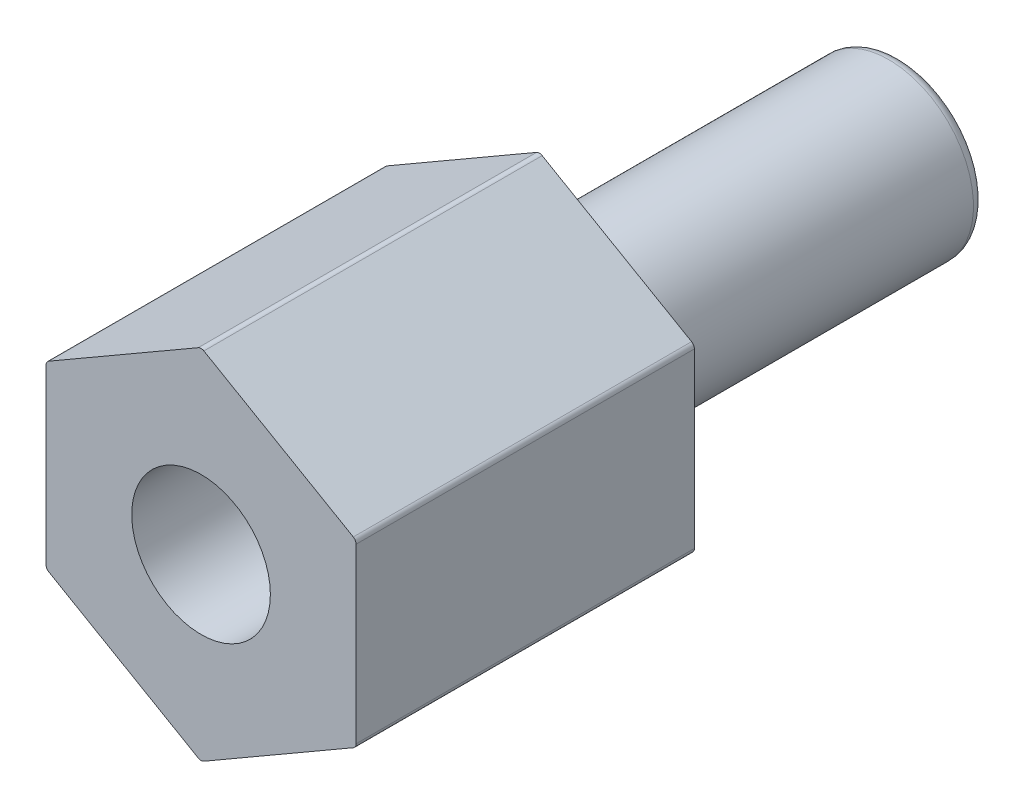
ISO-10303-21;
HEADER;
FILE_DESCRIPTION(('STEP AP214'),'2;1');
FILE_NAME('part.step','',(''),(''),'','','');
FILE_SCHEMA(('AUTOMOTIVE_DESIGN { 1 0 10303 214 1 1 1 1 }'));
ENDSEC;
DATA;
#1=APPLICATION_CONTEXT('core data for automotive mechanical design processes');
#2=APPLICATION_PROTOCOL_DEFINITION('international standard','automotive_design',2000,#1);
#3=PRODUCT_CONTEXT('',#1,'mechanical');
#4=PRODUCT('Part','Part','',(#3));
#5=PRODUCT_RELATED_PRODUCT_CATEGORY('part','',(#4));
#6=PRODUCT_DEFINITION_FORMATION('','',#4);
#7=PRODUCT_DEFINITION_CONTEXT('part definition',#1,'design');
#8=PRODUCT_DEFINITION('design','',#6,#7);
#9=PRODUCT_DEFINITION_SHAPE('','',#8);
#10=(LENGTH_UNIT() NAMED_UNIT(*) SI_UNIT(.MILLI.,.METRE.));
#11=(NAMED_UNIT(*) PLANE_ANGLE_UNIT() SI_UNIT($,.RADIAN.));
#12=(NAMED_UNIT(*) SI_UNIT($,.STERADIAN.) SOLID_ANGLE_UNIT());
#13=UNCERTAINTY_MEASURE_WITH_UNIT(LENGTH_MEASURE(1.E-05),#10,'distance_accuracy_value','');
#14=(GEOMETRIC_REPRESENTATION_CONTEXT(3) GLOBAL_UNCERTAINTY_ASSIGNED_CONTEXT((#13)) GLOBAL_UNIT_ASSIGNED_CONTEXT((#10,
#11,#12)) REPRESENTATION_CONTEXT('',''));
#15=CARTESIAN_POINT('',(0.,0.,0.));
#16=DIRECTION('',(0.,0.,1.));
#17=DIRECTION('',(1.,0.,0.));
#18=AXIS2_PLACEMENT_3D('',#15,#16,#17);
#19=CARTESIAN_POINT('',(0.,0.,-6.2));
#20=DIRECTION('',(0.,0.,-1.));
#21=DIRECTION('',(-1.,0.,0.));
#22=AXIS2_PLACEMENT_3D('',#19,#20,#21);
#23=TOROIDAL_SURFACE('',#22,1.3,0.2);
#24=CARTESIAN_POINT('',(0.,0.,-6.2));
#25=DIRECTION('',(0.,0.,-1.));
#26=DIRECTION('',(1.,0.,0.));
#27=AXIS2_PLACEMENT_3D('',#24,#25,#26);
#28=CIRCLE('',#27,1.5);
#29=CARTESIAN_POINT('',(-1.5,0.,-6.2));
#30=VERTEX_POINT('',#29);
#31=EDGE_CURVE('E11',#30,#30,#28,.T.);
#32=ORIENTED_EDGE('',*,*,#31,.T.);
#33=EDGE_LOOP('',(#32));
#34=FACE_BOUND('',#33,.T.);
#35=CARTESIAN_POINT('',(0.,0.,-6.4));
#36=DIRECTION('',(0.,0.,1.));
#37=DIRECTION('',(1.,0.,0.));
#38=AXIS2_PLACEMENT_3D('',#35,#36,#37);
#39=CIRCLE('',#38,1.3);
#40=CARTESIAN_POINT('',(-1.3,0.,-6.4));
#41=VERTEX_POINT('',#40);
#42=EDGE_CURVE('E30',#41,#41,#39,.T.);
#43=ORIENTED_EDGE('',*,*,#42,.T.);
#44=EDGE_LOOP('',(#43));
#45=FACE_BOUND('',#44,.T.);
#46=ADVANCED_FACE('F19',(#34,#45),#23,.T.);
#47=CARTESIAN_POINT('',(0.,0.,0.));
#48=DIRECTION('',(0.,0.,-1.));
#49=DIRECTION('',(1.,0.,0.));
#50=AXIS2_PLACEMENT_3D('',#47,#48,#49);
#51=CYLINDRICAL_SURFACE('',#50,1.5);
#52=CARTESIAN_POINT('',(0.,0.,0.));
#53=DIRECTION('',(0.,0.,1.));
#54=DIRECTION('',(1.,0.,0.));
#55=AXIS2_PLACEMENT_3D('',#52,#53,#54);
#56=CIRCLE('',#55,1.5);
#57=CARTESIAN_POINT('',(-1.5,0.,0.));
#58=VERTEX_POINT('',#57);
#59=EDGE_CURVE('E212',#58,#58,#56,.T.);
#60=ORIENTED_EDGE('',*,*,#59,.F.);
#61=EDGE_LOOP('',(#60));
#62=FACE_BOUND('',#61,.T.);
#63=ORIENTED_EDGE('',*,*,#31,.F.);
#64=EDGE_LOOP('',(#63));
#65=FACE_BOUND('',#64,.T.);
#66=ADVANCED_FACE('F323',(#62,#65),#51,.T.);
#67=CARTESIAN_POINT('',(0.,0.,-6.4));
#68=DIRECTION('',(0.,0.,1.));
#69=DIRECTION('',(1.,0.,0.));
#70=AXIS2_PLACEMENT_3D('',#67,#68,#69);
#71=PLANE('',#70);
#72=ORIENTED_EDGE('',*,*,#42,.F.);
#73=EDGE_LOOP('',(#72));
#74=FACE_BOUND('',#73,.T.);
#75=ADVANCED_FACE('F342',(#74),#71,.F.);
#76=CARTESIAN_POINT('',(0.,0.,0.));
#77=DIRECTION('',(0.,0.,1.));
#78=DIRECTION('',(1.,0.,0.));
#79=AXIS2_PLACEMENT_3D('',#76,#77,#78);
#80=PLANE('',#79);
#81=CARTESIAN_POINT('',(0.,0.,0.));
#82=DIRECTION('',(0.,0.,1.));
#83=DIRECTION('',(1.,0.,0.));
#84=AXIS2_PLACEMENT_3D('',#81,#82,#83);
#85=CIRCLE('',#84,1.2295);
#86=CARTESIAN_POINT('',(-1.2295,0.,0.));
#87=VERTEX_POINT('',#86);
#88=EDGE_CURVE('E186',#87,#87,#85,.T.);
#89=ORIENTED_EDGE('',*,*,#88,.T.);
#90=EDGE_LOOP('',(#89));
#91=FACE_BOUND('',#90,.T.);
#92=ADVANCED_FACE('F370',(#91),#80,.T.);
#93=CARTESIAN_POINT('',(-2.65,-1.53230652808246,0.));
#94=DIRECTION('',(0.,0.,1.));
#95=DIRECTION('',(-0.866181221002111,-0.499730019493819,0.));
#96=AXIS2_PLACEMENT_3D('',#93,#94,#95);
#97=CYLINDRICAL_SURFACE('',#96,0.1);
#98=CARTESIAN_POINT('',(-2.65,-1.53230652808246,6.));
#99=DIRECTION('',(0.,0.,-1.));
#100=DIRECTION('',(-0.866181221002111,-0.499730019493819,0.));
#101=AXIS2_PLACEMENT_3D('',#98,#99,#100);
#102=CIRCLE('',#101,0.1);
#103=CARTESIAN_POINT('',(-2.70005398152334,-1.61887787977378,6.));
#104=VERTEX_POINT('',#103);
#105=CARTESIAN_POINT('',(-2.75,-1.53230652808246,6.));
#106=VERTEX_POINT('',#105);
#107=EDGE_CURVE('E216',#104,#106,#102,.T.);
#108=ORIENTED_EDGE('',*,*,#107,.T.);
#109=DIRECTION('',(0.,0.,-1.));
#110=VECTOR('',#109,1.);
#111=CARTESIAN_POINT('',(-2.75,-1.53230652808246,0.));
#112=LINE('',#111,#110);
#113=CARTESIAN_POINT('',(-2.75,-1.53230652808246,0.));
#114=VERTEX_POINT('',#113);
#115=EDGE_CURVE('E206',#106,#114,#112,.T.);
#116=ORIENTED_EDGE('',*,*,#115,.T.);
#117=CARTESIAN_POINT('',(-2.65,-1.53230652808246,0.));
#118=DIRECTION('',(0.,0.,1.));
#119=DIRECTION('',(-0.866181221002111,-0.499730019493819,0.));
#120=AXIS2_PLACEMENT_3D('',#117,#118,#119);
#121=CIRCLE('',#120,0.1);
#122=CARTESIAN_POINT('',(-2.70005398152334,-1.61887787977378,0.));
#123=VERTEX_POINT('',#122);
#124=EDGE_CURVE('E202',#114,#123,#121,.T.);
#125=ORIENTED_EDGE('',*,*,#124,.T.);
#126=DIRECTION('',(0.,0.,1.));
#127=VECTOR('',#126,1.);
#128=CARTESIAN_POINT('',(-2.70005398152334,-1.61887787977378,0.));
#129=LINE('',#128,#127);
#130=EDGE_CURVE('E207',#123,#104,#129,.T.);
#131=ORIENTED_EDGE('',*,*,#130,.T.);
#132=EDGE_LOOP('',(#108,#116,#125,#131));
#133=FACE_BOUND('',#132,.T.);
#134=ADVANCED_FACE('F367',(#133),#97,.T.);
#135=CARTESIAN_POINT('',(-2.75,1.59,0.));
#136=DIRECTION('',(-1.,0.,0.));
#137=DIRECTION('',(0.,0.,1.));
#138=AXIS2_PLACEMENT_3D('',#135,#136,#137);
#139=PLANE('',#138);
#140=ORIENTED_EDGE('',*,*,#115,.F.);
#141=DIRECTION('',(0.,-1.,0.));
#142=VECTOR('',#141,1.);
#143=CARTESIAN_POINT('',(-2.75,-1.59,6.));
#144=LINE('',#143,#142);
#145=CARTESIAN_POINT('',(-2.75,1.53230652808246,6.));
#146=VERTEX_POINT('',#145);
#147=EDGE_CURVE('E149',#146,#106,#144,.T.);
#148=ORIENTED_EDGE('',*,*,#147,.F.);
#149=DIRECTION('',(0.,0.,1.));
#150=VECTOR('',#149,1.);
#151=CARTESIAN_POINT('',(-2.75,1.53230652808246,0.));
#152=LINE('',#151,#150);
#153=CARTESIAN_POINT('',(-2.75,1.53230652808246,0.));
#154=VERTEX_POINT('',#153);
#155=EDGE_CURVE('E201',#154,#146,#152,.T.);
#156=ORIENTED_EDGE('',*,*,#155,.F.);
#157=DIRECTION('',(0.,1.,0.));
#158=VECTOR('',#157,1.);
#159=CARTESIAN_POINT('',(-2.75,-1.59,0.));
#160=LINE('',#159,#158);
#161=EDGE_CURVE('E196',#114,#154,#160,.T.);
#162=ORIENTED_EDGE('',*,*,#161,.F.);
#163=EDGE_LOOP('',(#140,#148,#156,#162));
#164=FACE_BOUND('',#163,.T.);
#165=ADVANCED_FACE('F354',(#164),#139,.T.);
#166=CARTESIAN_POINT('',(0.,0.,6.));
#167=DIRECTION('',(0.,0.,1.));
#168=DIRECTION('',(1.,0.,0.));
#169=AXIS2_PLACEMENT_3D('',#166,#167,#168);
#170=PLANE('',#169);
#171=ORIENTED_EDGE('',*,*,#107,.F.);
#172=DIRECTION('',(0.865713516913132,-0.50053981523341,0.));
#173=VECTOR('',#172,1.);
#174=CARTESIAN_POINT('',(0.,-3.18,6.));
#175=LINE('',#174,#173);
#176=CARTESIAN_POINT('',(-0.050053981523341,-3.1510596979556,6.));
#177=VERTEX_POINT('',#176);
#178=EDGE_CURVE('E235',#104,#177,#175,.T.);
#179=ORIENTED_EDGE('',*,*,#178,.T.);
#180=CARTESIAN_POINT('',(0.,-3.06448834626428,6.));
#181=DIRECTION('',(0.,0.,-1.));
#182=DIRECTION('',(0.,-1.,0.));
#183=AXIS2_PLACEMENT_3D('',#180,#181,#182);
#184=CIRCLE('',#183,0.1);
#185=CARTESIAN_POINT('',(0.0500539815233414,-3.15105969795559,6.));
#186=VERTEX_POINT('',#185);
#187=EDGE_CURVE('E150',#186,#177,#184,.T.);
#188=ORIENTED_EDGE('',*,*,#187,.F.);
#189=DIRECTION('',(0.865713516913132,0.50053981523341,0.));
#190=VECTOR('',#189,1.);
#191=CARTESIAN_POINT('',(2.75,-1.59,6.));
#192=LINE('',#191,#190);
#193=CARTESIAN_POINT('',(2.70005398152334,-1.61887787977378,6.));
#194=VERTEX_POINT('',#193);
#195=EDGE_CURVE('E252',#186,#194,#192,.T.);
#196=ORIENTED_EDGE('',*,*,#195,.T.);
#197=CARTESIAN_POINT('',(2.65,-1.53230652808246,6.));
#198=DIRECTION('',(0.,0.,-1.));
#199=DIRECTION('',(0.866181221002107,-0.499730019493825,0.));
#200=AXIS2_PLACEMENT_3D('',#197,#198,#199);
#201=CIRCLE('',#200,0.1);
#202=CARTESIAN_POINT('',(2.75,-1.53230652808246,6.));
#203=VERTEX_POINT('',#202);
#204=EDGE_CURVE('E163',#203,#194,#201,.T.);
#205=ORIENTED_EDGE('',*,*,#204,.F.);
#206=DIRECTION('',(0.,1.,0.));
#207=VECTOR('',#206,1.);
#208=CARTESIAN_POINT('',(2.75,1.59,6.));
#209=LINE('',#208,#207);
#210=CARTESIAN_POINT('',(2.75,1.53230652808246,6.));
#211=VERTEX_POINT('',#210);
#212=EDGE_CURVE('E248',#203,#211,#209,.T.);
#213=ORIENTED_EDGE('',*,*,#212,.T.);
#214=CARTESIAN_POINT('',(2.65,1.53230652808246,6.));
#215=DIRECTION('',(0.,0.,-1.));
#216=DIRECTION('',(0.866181221002109,0.499730019493822,0.));
#217=AXIS2_PLACEMENT_3D('',#214,#215,#216);
#218=CIRCLE('',#217,0.1);
#219=CARTESIAN_POINT('',(2.70005398152334,1.61887787977378,6.));
#220=VERTEX_POINT('',#219);
#221=EDGE_CURVE('E213',#220,#211,#218,.T.);
#222=ORIENTED_EDGE('',*,*,#221,.F.);
#223=DIRECTION('',(-0.865713516913132,0.500539815233411,0.));
#224=VECTOR('',#223,1.);
#225=CARTESIAN_POINT('',(0.,3.18,6.));
#226=LINE('',#225,#224);
#227=CARTESIAN_POINT('',(0.0500539815233408,3.15105969795559,6.));
#228=VERTEX_POINT('',#227);
#229=EDGE_CURVE('E253',#220,#228,#226,.T.);
#230=ORIENTED_EDGE('',*,*,#229,.T.);
#231=CARTESIAN_POINT('',(0.,3.06448834626428,6.));
#232=DIRECTION('',(0.,0.,-1.));
#233=DIRECTION('',(0.,1.,0.));
#234=AXIS2_PLACEMENT_3D('',#231,#232,#233);
#235=CIRCLE('',#234,0.1);
#236=CARTESIAN_POINT('',(-0.050053981523342,3.15105969795559,6.));
#237=VERTEX_POINT('',#236);
#238=EDGE_CURVE('E166',#237,#228,#235,.T.);
#239=ORIENTED_EDGE('',*,*,#238,.F.);
#240=DIRECTION('',(-0.865713516913132,-0.500539815233411,0.));
#241=VECTOR('',#240,1.);
#242=CARTESIAN_POINT('',(-2.75,1.59,6.));
#243=LINE('',#242,#241);
#244=CARTESIAN_POINT('',(-2.70005398152334,1.61887787977378,6.));
#245=VERTEX_POINT('',#244);
#246=EDGE_CURVE('E158',#237,#245,#243,.T.);
#247=ORIENTED_EDGE('',*,*,#246,.T.);
#248=CARTESIAN_POINT('',(-2.65,1.53230652808246,6.));
#249=DIRECTION('',(0.,0.,-1.));
#250=DIRECTION('',(-0.866181221002109,0.499730019493822,0.));
#251=AXIS2_PLACEMENT_3D('',#248,#249,#250);
#252=CIRCLE('',#251,0.1);
#253=EDGE_CURVE('E191',#146,#245,#252,.T.);
#254=ORIENTED_EDGE('',*,*,#253,.F.);
#255=ORIENTED_EDGE('',*,*,#147,.T.);
#256=EDGE_LOOP('',(#171,#179,#188,#196,#205,#213,#222,#230,#239,#247,#254,#255));
#257=FACE_BOUND('',#256,.T.);
#258=CARTESIAN_POINT('',(0.,0.,6.));
#259=DIRECTION('',(0.,0.,-1.));
#260=DIRECTION('',(1.,0.,0.));
#261=AXIS2_PLACEMENT_3D('',#258,#259,#260);
#262=CIRCLE('',#261,1.2295);
#263=CARTESIAN_POINT('',(1.2295,0.,6.));
#264=VERTEX_POINT('',#263);
#265=EDGE_CURVE('E145',#264,#264,#262,.T.);
#266=ORIENTED_EDGE('',*,*,#265,.T.);
#267=EDGE_LOOP('',(#266));
#268=FACE_BOUND('',#267,.T.);
#269=ADVANCED_FACE('F304',(#257,#268),#170,.T.);
#270=CARTESIAN_POINT('',(0.,-3.06448834626428,0.));
#271=DIRECTION('',(0.,0.,1.));
#272=DIRECTION('',(0.,-1.,0.));
#273=AXIS2_PLACEMENT_3D('',#270,#271,#272);
#274=CYLINDRICAL_SURFACE('',#273,0.1);
#275=ORIENTED_EDGE('',*,*,#187,.T.);
#276=DIRECTION('',(0.,0.,-1.));
#277=VECTOR('',#276,1.);
#278=CARTESIAN_POINT('',(-0.0500539815233408,-3.15105969795559,0.));
#279=LINE('',#278,#277);
#280=CARTESIAN_POINT('',(-0.050053981523341,-3.1510596979556,0.));
#281=VERTEX_POINT('',#280);
#282=EDGE_CURVE('E160',#177,#281,#279,.T.);
#283=ORIENTED_EDGE('',*,*,#282,.T.);
#284=CARTESIAN_POINT('',(0.,-3.06448834626428,0.));
#285=DIRECTION('',(0.,0.,1.));
#286=DIRECTION('',(0.,-1.,0.));
#287=AXIS2_PLACEMENT_3D('',#284,#285,#286);
#288=CIRCLE('',#287,0.1);
#289=CARTESIAN_POINT('',(0.0500539815233414,-3.15105969795559,0.));
#290=VERTEX_POINT('',#289);
#291=EDGE_CURVE('E227',#281,#290,#288,.T.);
#292=ORIENTED_EDGE('',*,*,#291,.T.);
#293=DIRECTION('',(0.,0.,1.));
#294=VECTOR('',#293,1.);
#295=CARTESIAN_POINT('',(0.0500539815233412,-3.15105969795559,0.));
#296=LINE('',#295,#294);
#297=EDGE_CURVE('E231',#290,#186,#296,.T.);
#298=ORIENTED_EDGE('',*,*,#297,.T.);
#299=EDGE_LOOP('',(#275,#283,#292,#298));
#300=FACE_BOUND('',#299,.T.);
#301=ADVANCED_FACE('F353',(#300),#274,.T.);
#302=CARTESIAN_POINT('',(0.,-3.18,0.));
#303=DIRECTION('',(0.50053981523341,-0.865713516913132,0.));
#304=DIRECTION('',(0.,0.,-1.));
#305=AXIS2_PLACEMENT_3D('',#302,#303,#304);
#306=PLANE('',#305);
#307=ORIENTED_EDGE('',*,*,#297,.F.);
#308=DIRECTION('',(-0.865713516913132,-0.50053981523341,0.));
#309=VECTOR('',#308,1.);
#310=CARTESIAN_POINT('',(2.75,-1.59,0.));
#311=LINE('',#310,#309);
#312=CARTESIAN_POINT('',(2.70005398152334,-1.61887787977378,0.));
#313=VERTEX_POINT('',#312);
#314=EDGE_CURVE('E23',#313,#290,#311,.T.);
#315=ORIENTED_EDGE('',*,*,#314,.F.);
#316=DIRECTION('',(0.,0.,-1.));
#317=VECTOR('',#316,1.);
#318=CARTESIAN_POINT('',(2.70005398152334,-1.61887787977378,0.));
#319=LINE('',#318,#317);
#320=EDGE_CURVE('E254',#194,#313,#319,.T.);
#321=ORIENTED_EDGE('',*,*,#320,.F.);
#322=ORIENTED_EDGE('',*,*,#195,.F.);
#323=EDGE_LOOP('',(#307,#315,#321,#322));
#324=FACE_BOUND('',#323,.T.);
#325=ADVANCED_FACE('F378',(#324),#306,.T.);
#326=CARTESIAN_POINT('',(2.65,-1.53230652808246,0.));
#327=DIRECTION('',(0.,0.,1.));
#328=DIRECTION('',(0.866181221002107,-0.499730019493825,0.));
#329=AXIS2_PLACEMENT_3D('',#326,#327,#328);
#330=CYLINDRICAL_SURFACE('',#329,0.1);
#331=ORIENTED_EDGE('',*,*,#204,.T.);
#332=ORIENTED_EDGE('',*,*,#320,.T.);
#333=CARTESIAN_POINT('',(2.65,-1.53230652808246,0.));
#334=DIRECTION('',(0.,0.,1.));
#335=DIRECTION('',(0.866181221002107,-0.499730019493825,0.));
#336=AXIS2_PLACEMENT_3D('',#333,#334,#335);
#337=CIRCLE('',#336,0.1);
#338=CARTESIAN_POINT('',(2.75,-1.53230652808246,0.));
#339=VERTEX_POINT('',#338);
#340=EDGE_CURVE('E258',#313,#339,#337,.T.);
#341=ORIENTED_EDGE('',*,*,#340,.T.);
#342=DIRECTION('',(0.,0.,1.));
#343=VECTOR('',#342,1.);
#344=CARTESIAN_POINT('',(2.75,-1.53230652808246,0.));
#345=LINE('',#344,#343);
#346=EDGE_CURVE('E259',#339,#203,#345,.T.);
#347=ORIENTED_EDGE('',*,*,#346,.T.);
#348=EDGE_LOOP('',(#331,#332,#341,#347));
#349=FACE_BOUND('',#348,.T.);
#350=ADVANCED_FACE('F291',(#349),#330,.T.);
#351=CARTESIAN_POINT('',(-2.65,1.53230652808246,0.));
#352=DIRECTION('',(0.,0.,1.));
#353=DIRECTION('',(-0.866181221002109,0.499730019493822,0.));
#354=AXIS2_PLACEMENT_3D('',#351,#352,#353);
#355=CYLINDRICAL_SURFACE('',#354,0.1);
#356=ORIENTED_EDGE('',*,*,#253,.T.);
#357=DIRECTION('',(0.,0.,-1.));
#358=VECTOR('',#357,1.);
#359=CARTESIAN_POINT('',(-2.70005398152334,1.61887787977378,0.));
#360=LINE('',#359,#358);
#361=CARTESIAN_POINT('',(-2.70005398152334,1.61887787977378,0.));
#362=VERTEX_POINT('',#361);
#363=EDGE_CURVE('E187',#245,#362,#360,.T.);
#364=ORIENTED_EDGE('',*,*,#363,.T.);
#365=CARTESIAN_POINT('',(-2.65,1.53230652808246,0.));
#366=DIRECTION('',(0.,0.,1.));
#367=DIRECTION('',(-0.866181221002109,0.499730019493822,0.));
#368=AXIS2_PLACEMENT_3D('',#365,#366,#367);
#369=CIRCLE('',#368,0.1);
#370=EDGE_CURVE('E192',#362,#154,#369,.T.);
#371=ORIENTED_EDGE('',*,*,#370,.T.);
#372=ORIENTED_EDGE('',*,*,#155,.T.);
#373=EDGE_LOOP('',(#356,#364,#371,#372));
#374=FACE_BOUND('',#373,.T.);
#375=ADVANCED_FACE('F347',(#374),#355,.T.);
#376=CARTESIAN_POINT('',(0.,3.18,0.));
#377=DIRECTION('',(-0.500539815233411,0.865713516913132,0.));
#378=DIRECTION('',(0.,0.,1.));
#379=AXIS2_PLACEMENT_3D('',#376,#377,#378);
#380=PLANE('',#379);
#381=ORIENTED_EDGE('',*,*,#363,.F.);
#382=ORIENTED_EDGE('',*,*,#246,.F.);
#383=DIRECTION('',(0.,0.,1.));
#384=VECTOR('',#383,1.);
#385=CARTESIAN_POINT('',(-0.0500539815233414,3.15105969795559,0.));
#386=LINE('',#385,#384);
#387=CARTESIAN_POINT('',(-0.050053981523342,3.15105969795559,0.));
#388=VERTEX_POINT('',#387);
#389=EDGE_CURVE('E223',#388,#237,#386,.T.);
#390=ORIENTED_EDGE('',*,*,#389,.F.);
#391=DIRECTION('',(0.865713516913132,0.500539815233411,0.));
#392=VECTOR('',#391,1.);
#393=CARTESIAN_POINT('',(-2.75,1.59,0.));
#394=LINE('',#393,#392);
#395=EDGE_CURVE('E193',#362,#388,#394,.T.);
#396=ORIENTED_EDGE('',*,*,#395,.F.);
#397=EDGE_LOOP('',(#381,#382,#390,#396));
#398=FACE_BOUND('',#397,.T.);
#399=ADVANCED_FACE('F372',(#398),#380,.T.);
#400=CARTESIAN_POINT('',(2.65,1.53230652808246,0.));
#401=DIRECTION('',(0.,0.,1.));
#402=DIRECTION('',(0.866181221002109,0.499730019493822,0.));
#403=AXIS2_PLACEMENT_3D('',#400,#401,#402);
#404=CYLINDRICAL_SURFACE('',#403,0.1);
#405=ORIENTED_EDGE('',*,*,#221,.T.);
#406=DIRECTION('',(0.,0.,-1.));
#407=VECTOR('',#406,1.);
#408=CARTESIAN_POINT('',(2.75,1.53230652808246,0.));
#409=LINE('',#408,#407);
#410=CARTESIAN_POINT('',(2.75,1.53230652808246,0.));
#411=VERTEX_POINT('',#410);
#412=EDGE_CURVE('E173',#211,#411,#409,.T.);
#413=ORIENTED_EDGE('',*,*,#412,.T.);
#414=CARTESIAN_POINT('',(2.65,1.53230652808246,0.));
#415=DIRECTION('',(0.,0.,1.));
#416=DIRECTION('',(0.866181221002109,0.499730019493822,0.));
#417=AXIS2_PLACEMENT_3D('',#414,#415,#416);
#418=CIRCLE('',#417,0.1);
#419=CARTESIAN_POINT('',(2.70005398152334,1.61887787977378,0.));
#420=VERTEX_POINT('',#419);
#421=EDGE_CURVE('E165',#411,#420,#418,.T.);
#422=ORIENTED_EDGE('',*,*,#421,.T.);
#423=DIRECTION('',(0.,0.,1.));
#424=VECTOR('',#423,1.);
#425=CARTESIAN_POINT('',(2.70005398152334,1.61887787977378,0.));
#426=LINE('',#425,#424);
#427=EDGE_CURVE('E128',#420,#220,#426,.T.);
#428=ORIENTED_EDGE('',*,*,#427,.T.);
#429=EDGE_LOOP('',(#405,#413,#422,#428));
#430=FACE_BOUND('',#429,.T.);
#431=ADVANCED_FACE('F351',(#430),#404,.T.);
#432=CARTESIAN_POINT('',(2.75,-1.59,0.));
#433=DIRECTION('',(1.,0.,0.));
#434=DIRECTION('',(0.,1.,0.));
#435=AXIS2_PLACEMENT_3D('',#432,#433,#434);
#436=PLANE('',#435);
#437=ORIENTED_EDGE('',*,*,#346,.F.);
#438=DIRECTION('',(0.,-1.,0.));
#439=VECTOR('',#438,1.);
#440=CARTESIAN_POINT('',(2.75,1.59,0.));
#441=LINE('',#440,#439);
#442=EDGE_CURVE('E244',#411,#339,#441,.T.);
#443=ORIENTED_EDGE('',*,*,#442,.F.);
#444=ORIENTED_EDGE('',*,*,#412,.F.);
#445=ORIENTED_EDGE('',*,*,#212,.F.);
#446=EDGE_LOOP('',(#437,#443,#444,#445));
#447=FACE_BOUND('',#446,.T.);
#448=ADVANCED_FACE('F299',(#447),#436,.T.);
#449=CARTESIAN_POINT('',(0.,3.06448834626428,0.));
#450=DIRECTION('',(0.,0.,1.));
#451=DIRECTION('',(0.,1.,0.));
#452=AXIS2_PLACEMENT_3D('',#449,#450,#451);
#453=CYLINDRICAL_SURFACE('',#452,0.1);
#454=ORIENTED_EDGE('',*,*,#238,.T.);
#455=DIRECTION('',(0.,0.,-1.));
#456=VECTOR('',#455,1.);
#457=CARTESIAN_POINT('',(0.050053981523341,3.1510596979556,0.));
#458=LINE('',#457,#456);
#459=CARTESIAN_POINT('',(0.0500539815233408,3.15105969795559,0.));
#460=VERTEX_POINT('',#459);
#461=EDGE_CURVE('E175',#228,#460,#458,.T.);
#462=ORIENTED_EDGE('',*,*,#461,.T.);
#463=CARTESIAN_POINT('',(0.,3.06448834626428,0.));
#464=DIRECTION('',(0.,0.,1.));
#465=DIRECTION('',(0.,1.,0.));
#466=AXIS2_PLACEMENT_3D('',#463,#464,#465);
#467=CIRCLE('',#466,0.1);
#468=EDGE_CURVE('E115',#460,#388,#467,.T.);
#469=ORIENTED_EDGE('',*,*,#468,.T.);
#470=ORIENTED_EDGE('',*,*,#389,.T.);
#471=EDGE_LOOP('',(#454,#462,#469,#470));
#472=FACE_BOUND('',#471,.T.);
#473=ADVANCED_FACE('F21',(#472),#453,.T.);
#474=CARTESIAN_POINT('',(0.,0.,1.6));
#475=DIRECTION('',(0.,0.,1.));
#476=DIRECTION('',(1.,0.,0.));
#477=AXIS2_PLACEMENT_3D('',#474,#475,#476);
#478=CYLINDRICAL_SURFACE('',#477,1.2295);
#479=ORIENTED_EDGE('',*,*,#88,.F.);
#480=EDGE_LOOP('',(#479));
#481=FACE_BOUND('',#480,.T.);
#482=ORIENTED_EDGE('',*,*,#265,.F.);
#483=EDGE_LOOP('',(#482));
#484=FACE_BOUND('',#483,.T.);
#485=ADVANCED_FACE('F146',(#481,#484),#478,.F.);
#486=CARTESIAN_POINT('',(2.75,1.59,0.));
#487=DIRECTION('',(0.500539815233411,0.865713516913132,0.));
#488=DIRECTION('',(0.,0.,-1.));
#489=AXIS2_PLACEMENT_3D('',#486,#487,#488);
#490=PLANE('',#489);
#491=ORIENTED_EDGE('',*,*,#427,.F.);
#492=DIRECTION('',(0.865713516913132,-0.500539815233411,0.));
#493=VECTOR('',#492,1.);
#494=CARTESIAN_POINT('',(0.,3.18,0.));
#495=LINE('',#494,#493);
#496=EDGE_CURVE('E197',#460,#420,#495,.T.);
#497=ORIENTED_EDGE('',*,*,#496,.F.);
#498=ORIENTED_EDGE('',*,*,#461,.F.);
#499=ORIENTED_EDGE('',*,*,#229,.F.);
#500=EDGE_LOOP('',(#491,#497,#498,#499));
#501=FACE_BOUND('',#500,.T.);
#502=ADVANCED_FACE('F331',(#501),#490,.T.);
#503=CARTESIAN_POINT('',(-2.75,-1.59,0.));
#504=DIRECTION('',(-0.50053981523341,-0.865713516913132,0.));
#505=DIRECTION('',(-0.865713516913132,0.50053981523341,0.));
#506=AXIS2_PLACEMENT_3D('',#503,#504,#505);
#507=PLANE('',#506);
#508=ORIENTED_EDGE('',*,*,#130,.F.);
#509=DIRECTION('',(-0.865713516913132,0.50053981523341,0.));
#510=VECTOR('',#509,1.);
#511=CARTESIAN_POINT('',(0.,-3.18,0.));
#512=LINE('',#511,#510);
#513=EDGE_CURVE('E208',#281,#123,#512,.T.);
#514=ORIENTED_EDGE('',*,*,#513,.F.);
#515=ORIENTED_EDGE('',*,*,#282,.F.);
#516=ORIENTED_EDGE('',*,*,#178,.F.);
#517=EDGE_LOOP('',(#508,#514,#515,#516));
#518=FACE_BOUND('',#517,.T.);
#519=ADVANCED_FACE('F325',(#518),#507,.T.);
#520=CARTESIAN_POINT('',(0.,0.,0.));
#521=DIRECTION('',(0.,0.,1.));
#522=DIRECTION('',(1.,0.,0.));
#523=AXIS2_PLACEMENT_3D('',#520,#521,#522);
#524=PLANE('',#523);
#525=ORIENTED_EDGE('',*,*,#124,.F.);
#526=ORIENTED_EDGE('',*,*,#161,.T.);
#527=ORIENTED_EDGE('',*,*,#370,.F.);
#528=ORIENTED_EDGE('',*,*,#395,.T.);
#529=ORIENTED_EDGE('',*,*,#468,.F.);
#530=ORIENTED_EDGE('',*,*,#496,.T.);
#531=ORIENTED_EDGE('',*,*,#421,.F.);
#532=ORIENTED_EDGE('',*,*,#442,.T.);
#533=ORIENTED_EDGE('',*,*,#340,.F.);
#534=ORIENTED_EDGE('',*,*,#314,.T.);
#535=ORIENTED_EDGE('',*,*,#291,.F.);
#536=ORIENTED_EDGE('',*,*,#513,.T.);
#537=EDGE_LOOP('',(#525,#526,#527,#528,#529,#530,#531,#532,#533,#534,#535,#536));
#538=FACE_BOUND('',#537,.T.);
#539=ORIENTED_EDGE('',*,*,#59,.T.);
#540=EDGE_LOOP('',(#539));
#541=FACE_BOUND('',#540,.T.);
#542=ADVANCED_FACE('F295',(#538,#541),#524,.F.);
#543=CLOSED_SHELL('',(#46,#66,#75,#92,#134,#165,#269,#301,#325,#350,#375,#399,#431,#448,#473,
#485,#502,#519,#542));
#544=MANIFOLD_SOLID_BREP('B1',#543);
#545=ADVANCED_BREP_SHAPE_REPRESENTATION('',(#18,#544),#14);
#546=SHAPE_DEFINITION_REPRESENTATION(#9,#545);
ENDSEC;
END-ISO-10303-21;
